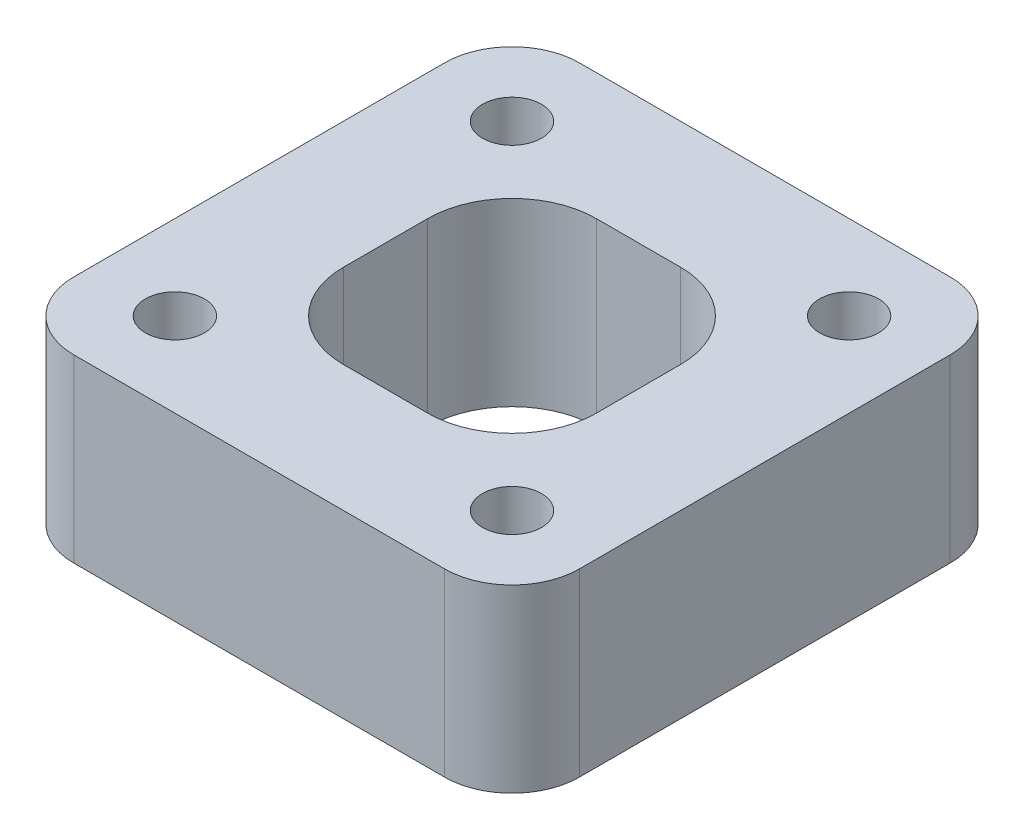
ISO-10303-21;
HEADER;
FILE_DESCRIPTION(('STEP AP214'),'2;1');
FILE_NAME('part.step','',(''),(''),'','','');
FILE_SCHEMA(('AUTOMOTIVE_DESIGN { 1 0 10303 214 1 1 1 1 }'));
ENDSEC;
DATA;
#1=APPLICATION_CONTEXT('core data for automotive mechanical design processes');
#2=APPLICATION_PROTOCOL_DEFINITION('international standard','automotive_design',2000,#1);
#3=PRODUCT_CONTEXT('',#1,'mechanical');
#4=PRODUCT('Part','Part','',(#3));
#5=PRODUCT_RELATED_PRODUCT_CATEGORY('part','',(#4));
#6=PRODUCT_DEFINITION_FORMATION('','',#4);
#7=PRODUCT_DEFINITION_CONTEXT('part definition',#1,'design');
#8=PRODUCT_DEFINITION('design','',#6,#7);
#9=PRODUCT_DEFINITION_SHAPE('','',#8);
#10=(LENGTH_UNIT() NAMED_UNIT(*) SI_UNIT(.MILLI.,.METRE.));
#11=(NAMED_UNIT(*) PLANE_ANGLE_UNIT() SI_UNIT($,.RADIAN.));
#12=(NAMED_UNIT(*) SI_UNIT($,.STERADIAN.) SOLID_ANGLE_UNIT());
#13=UNCERTAINTY_MEASURE_WITH_UNIT(LENGTH_MEASURE(1.E-05),#10,'distance_accuracy_value','');
#14=(GEOMETRIC_REPRESENTATION_CONTEXT(3) GLOBAL_UNCERTAINTY_ASSIGNED_CONTEXT((#13)) GLOBAL_UNIT_ASSIGNED_CONTEXT((#10,
#11,#12)) REPRESENTATION_CONTEXT('',''));
#15=CARTESIAN_POINT('',(0.,0.,0.));
#16=DIRECTION('',(0.,0.,1.));
#17=DIRECTION('',(1.,0.,0.));
#18=AXIS2_PLACEMENT_3D('',#15,#16,#17);
#19=CARTESIAN_POINT('',(15.,5.35,15.));
#20=DIRECTION('',(-1.,0.,0.));
#21=DIRECTION('',(0.,0.,1.));
#22=AXIS2_PLACEMENT_3D('',#19,#20,#21);
#23=PLANE('',#22);
#24=DIRECTION('',(0.,0.,-1.));
#25=VECTOR('',#24,1.);
#26=CARTESIAN_POINT('',(15.,-5.35,15.));
#27=LINE('',#26,#25);
#28=CARTESIAN_POINT('',(15.,-5.35,11.));
#29=VERTEX_POINT('',#28);
#30=CARTESIAN_POINT('',(15.,-5.35,-11.));
#31=VERTEX_POINT('',#30);
#32=EDGE_CURVE('E212',#29,#31,#27,.T.);
#33=ORIENTED_EDGE('',*,*,#32,.T.);
#34=DIRECTION('',(0.,-1.,0.));
#35=VECTOR('',#34,1.);
#36=CARTESIAN_POINT('',(15.,5.35,-11.));
#37=LINE('',#36,#35);
#38=CARTESIAN_POINT('',(15.,5.35,-11.));
#39=VERTEX_POINT('',#38);
#40=EDGE_CURVE('E11',#31,#39,#37,.F.);
#41=ORIENTED_EDGE('',*,*,#40,.T.);
#42=DIRECTION('',(0.,0.,-1.));
#43=VECTOR('',#42,1.);
#44=CARTESIAN_POINT('',(15.,5.35,15.));
#45=LINE('',#44,#43);
#46=CARTESIAN_POINT('',(15.,5.35,11.));
#47=VERTEX_POINT('',#46);
#48=EDGE_CURVE('E215',#47,#39,#45,.T.);
#49=ORIENTED_EDGE('',*,*,#48,.F.);
#50=DIRECTION('',(0.,-1.,0.));
#51=VECTOR('',#50,1.);
#52=CARTESIAN_POINT('',(15.,5.35,11.));
#53=LINE('',#52,#51);
#54=EDGE_CURVE('E43',#47,#29,#53,.T.);
#55=ORIENTED_EDGE('',*,*,#54,.T.);
#56=EDGE_LOOP('',(#33,#41,#49,#55));
#57=FACE_BOUND('',#56,.T.);
#58=ADVANCED_FACE('F35',(#57),#23,.F.);
#59=CARTESIAN_POINT('',(-15.,5.35,-15.));
#60=DIRECTION('',(0.,0.,1.));
#61=DIRECTION('',(1.,0.,0.));
#62=AXIS2_PLACEMENT_3D('',#59,#60,#61);
#63=PLANE('',#62);
#64=DIRECTION('',(-1.,0.,0.));
#65=VECTOR('',#64,1.);
#66=CARTESIAN_POINT('',(-15.,-5.35,-15.));
#67=LINE('',#66,#65);
#68=CARTESIAN_POINT('',(11.,-5.35,-15.));
#69=VERTEX_POINT('',#68);
#70=CARTESIAN_POINT('',(-11.,-5.35,-15.));
#71=VERTEX_POINT('',#70);
#72=EDGE_CURVE('E228',#69,#71,#67,.T.);
#73=ORIENTED_EDGE('',*,*,#72,.T.);
#74=DIRECTION('',(0.,-1.,0.));
#75=VECTOR('',#74,1.);
#76=CARTESIAN_POINT('',(-11.,5.35,-15.));
#77=LINE('',#76,#75);
#78=CARTESIAN_POINT('',(-11.,5.35,-15.));
#79=VERTEX_POINT('',#78);
#80=EDGE_CURVE('E50',#71,#79,#77,.F.);
#81=ORIENTED_EDGE('',*,*,#80,.T.);
#82=DIRECTION('',(-1.,0.,0.));
#83=VECTOR('',#82,1.);
#84=CARTESIAN_POINT('',(-15.,5.35,-15.));
#85=LINE('',#84,#83);
#86=CARTESIAN_POINT('',(11.,5.35,-15.));
#87=VERTEX_POINT('',#86);
#88=EDGE_CURVE('E217',#87,#79,#85,.T.);
#89=ORIENTED_EDGE('',*,*,#88,.F.);
#90=DIRECTION('',(0.,-1.,0.));
#91=VECTOR('',#90,1.);
#92=CARTESIAN_POINT('',(11.,5.35,-15.));
#93=LINE('',#92,#91);
#94=EDGE_CURVE('E285',#87,#69,#93,.T.);
#95=ORIENTED_EDGE('',*,*,#94,.T.);
#96=EDGE_LOOP('',(#73,#81,#89,#95));
#97=FACE_BOUND('',#96,.T.);
#98=ADVANCED_FACE('F303',(#97),#63,.F.);
#99=CARTESIAN_POINT('',(-15.,5.35,15.));
#100=DIRECTION('',(1.,0.,0.));
#101=DIRECTION('',(0.,0.,-1.));
#102=AXIS2_PLACEMENT_3D('',#99,#100,#101);
#103=PLANE('',#102);
#104=DIRECTION('',(0.,0.,1.));
#105=VECTOR('',#104,1.);
#106=CARTESIAN_POINT('',(-15.,-5.35,15.));
#107=LINE('',#106,#105);
#108=CARTESIAN_POINT('',(-15.,-5.35,-11.));
#109=VERTEX_POINT('',#108);
#110=CARTESIAN_POINT('',(-15.,-5.35,11.));
#111=VERTEX_POINT('',#110);
#112=EDGE_CURVE('E230',#109,#111,#107,.T.);
#113=ORIENTED_EDGE('',*,*,#112,.T.);
#114=DIRECTION('',(0.,-1.,0.));
#115=VECTOR('',#114,1.);
#116=CARTESIAN_POINT('',(-15.,5.35,11.));
#117=LINE('',#116,#115);
#118=CARTESIAN_POINT('',(-15.,5.35,11.));
#119=VERTEX_POINT('',#118);
#120=EDGE_CURVE('E276',#111,#119,#117,.F.);
#121=ORIENTED_EDGE('',*,*,#120,.T.);
#122=DIRECTION('',(0.,0.,1.));
#123=VECTOR('',#122,1.);
#124=CARTESIAN_POINT('',(-15.,5.35,15.));
#125=LINE('',#124,#123);
#126=CARTESIAN_POINT('',(-15.,5.35,-11.));
#127=VERTEX_POINT('',#126);
#128=EDGE_CURVE('E220',#127,#119,#125,.T.);
#129=ORIENTED_EDGE('',*,*,#128,.F.);
#130=DIRECTION('',(0.,-1.,0.));
#131=VECTOR('',#130,1.);
#132=CARTESIAN_POINT('',(-15.,5.35,-11.));
#133=LINE('',#132,#131);
#134=EDGE_CURVE('E273',#127,#109,#133,.T.);
#135=ORIENTED_EDGE('',*,*,#134,.T.);
#136=EDGE_LOOP('',(#113,#121,#129,#135));
#137=FACE_BOUND('',#136,.T.);
#138=ADVANCED_FACE('F311',(#137),#103,.F.);
#139=CARTESIAN_POINT('',(-15.,5.35,15.));
#140=DIRECTION('',(0.,0.,-1.));
#141=DIRECTION('',(-1.,0.,0.));
#142=AXIS2_PLACEMENT_3D('',#139,#140,#141);
#143=PLANE('',#142);
#144=DIRECTION('',(1.,0.,0.));
#145=VECTOR('',#144,1.);
#146=CARTESIAN_POINT('',(-15.,5.35,15.));
#147=LINE('',#146,#145);
#148=CARTESIAN_POINT('',(-11.,5.35,15.));
#149=VERTEX_POINT('',#148);
#150=CARTESIAN_POINT('',(11.,5.35,15.));
#151=VERTEX_POINT('',#150);
#152=EDGE_CURVE('E223',#149,#151,#147,.T.);
#153=ORIENTED_EDGE('',*,*,#152,.F.);
#154=DIRECTION('',(0.,-1.,0.));
#155=VECTOR('',#154,1.);
#156=CARTESIAN_POINT('',(-11.,5.35,15.));
#157=LINE('',#156,#155);
#158=CARTESIAN_POINT('',(-11.,-5.35,15.));
#159=VERTEX_POINT('',#158);
#160=EDGE_CURVE('E262',#149,#159,#157,.T.);
#161=ORIENTED_EDGE('',*,*,#160,.T.);
#162=DIRECTION('',(1.,0.,0.));
#163=VECTOR('',#162,1.);
#164=CARTESIAN_POINT('',(-15.,-5.35,15.));
#165=LINE('',#164,#163);
#166=CARTESIAN_POINT('',(11.,-5.35,15.));
#167=VERTEX_POINT('',#166);
#168=EDGE_CURVE('E218',#159,#167,#165,.T.);
#169=ORIENTED_EDGE('',*,*,#168,.T.);
#170=DIRECTION('',(0.,-1.,0.));
#171=VECTOR('',#170,1.);
#172=CARTESIAN_POINT('',(11.,5.35,15.));
#173=LINE('',#172,#171);
#174=EDGE_CURVE('E260',#167,#151,#173,.F.);
#175=ORIENTED_EDGE('',*,*,#174,.T.);
#176=EDGE_LOOP('',(#153,#161,#169,#175));
#177=FACE_BOUND('',#176,.T.);
#178=ADVANCED_FACE('F319',(#177),#143,.F.);
#179=CARTESIAN_POINT('',(0.,5.35,0.));
#180=DIRECTION('',(0.,-1.,0.));
#181=DIRECTION('',(0.,0.,-1.));
#182=AXIS2_PLACEMENT_3D('',#179,#180,#181);
#183=PLANE('',#182);
#184=DIRECTION('',(1.,0.,0.));
#185=VECTOR('',#184,1.);
#186=CARTESIAN_POINT('',(-7.5,5.35,7.5));
#187=LINE('',#186,#185);
#188=CARTESIAN_POINT('',(-2.5,5.35,7.5));
#189=VERTEX_POINT('',#188);
#190=CARTESIAN_POINT('',(2.5,5.35,7.5));
#191=VERTEX_POINT('',#190);
#192=EDGE_CURVE('E166',#189,#191,#187,.T.);
#193=ORIENTED_EDGE('',*,*,#192,.F.);
#194=CARTESIAN_POINT('',(-2.5,5.35,2.5));
#195=DIRECTION('',(0.,-1.,0.));
#196=DIRECTION('',(0.,0.,-1.));
#197=AXIS2_PLACEMENT_3D('',#194,#195,#196);
#198=CIRCLE('',#197,5.);
#199=CARTESIAN_POINT('',(-7.5,5.35,2.5));
#200=VERTEX_POINT('',#199);
#201=EDGE_CURVE('E149',#189,#200,#198,.T.);
#202=ORIENTED_EDGE('',*,*,#201,.T.);
#203=DIRECTION('',(0.,0.,1.));
#204=VECTOR('',#203,1.);
#205=CARTESIAN_POINT('',(-7.5,5.35,-7.5));
#206=LINE('',#205,#204);
#207=CARTESIAN_POINT('',(-7.5,5.35,-2.5));
#208=VERTEX_POINT('',#207);
#209=EDGE_CURVE('E178',#208,#200,#206,.T.);
#210=ORIENTED_EDGE('',*,*,#209,.F.);
#211=CARTESIAN_POINT('',(-2.5,5.35,-2.5));
#212=DIRECTION('',(0.,-1.,0.));
#213=DIRECTION('',(0.,0.,-1.));
#214=AXIS2_PLACEMENT_3D('',#211,#212,#213);
#215=CIRCLE('',#214,5.);
#216=CARTESIAN_POINT('',(-2.5,5.35,-7.5));
#217=VERTEX_POINT('',#216);
#218=EDGE_CURVE('E256',#208,#217,#215,.T.);
#219=ORIENTED_EDGE('',*,*,#218,.T.);
#220=DIRECTION('',(-1.,0.,0.));
#221=VECTOR('',#220,1.);
#222=CARTESIAN_POINT('',(-7.5,5.35,-7.5));
#223=LINE('',#222,#221);
#224=CARTESIAN_POINT('',(2.5,5.35,-7.5));
#225=VERTEX_POINT('',#224);
#226=EDGE_CURVE('E181',#225,#217,#223,.T.);
#227=ORIENTED_EDGE('',*,*,#226,.F.);
#228=CARTESIAN_POINT('',(2.5,5.35,-2.5));
#229=DIRECTION('',(0.,-1.,0.));
#230=DIRECTION('',(0.,0.,-1.));
#231=AXIS2_PLACEMENT_3D('',#228,#229,#230);
#232=CIRCLE('',#231,5.);
#233=CARTESIAN_POINT('',(7.5,5.35,-2.5));
#234=VERTEX_POINT('',#233);
#235=EDGE_CURVE('E252',#225,#234,#232,.T.);
#236=ORIENTED_EDGE('',*,*,#235,.T.);
#237=DIRECTION('',(0.,0.,-1.));
#238=VECTOR('',#237,1.);
#239=CARTESIAN_POINT('',(7.5,5.35,-7.5));
#240=LINE('',#239,#238);
#241=CARTESIAN_POINT('',(7.5,5.35,2.5));
#242=VERTEX_POINT('',#241);
#243=EDGE_CURVE('E177',#242,#234,#240,.T.);
#244=ORIENTED_EDGE('',*,*,#243,.F.);
#245=CARTESIAN_POINT('',(2.5,5.35,2.5));
#246=DIRECTION('',(0.,-1.,0.));
#247=DIRECTION('',(0.,0.,-1.));
#248=AXIS2_PLACEMENT_3D('',#245,#246,#247);
#249=CIRCLE('',#248,5.);
#250=EDGE_CURVE('E176',#242,#191,#249,.T.);
#251=ORIENTED_EDGE('',*,*,#250,.T.);
#252=EDGE_LOOP('',(#193,#202,#210,#219,#227,#236,#244,#251));
#253=FACE_BOUND('',#252,.T.);
#254=CARTESIAN_POINT('',(10.,5.35,-10.));
#255=DIRECTION('',(0.,1.,0.));
#256=DIRECTION('',(0.,0.,1.));
#257=AXIS2_PLACEMENT_3D('',#254,#255,#256);
#258=CIRCLE('',#257,1.75);
#259=CARTESIAN_POINT('',(10.,5.35,-8.25));
#260=VERTEX_POINT('',#259);
#261=EDGE_CURVE('E189',#260,#260,#258,.T.);
#262=ORIENTED_EDGE('',*,*,#261,.F.);
#263=EDGE_LOOP('',(#262));
#264=FACE_BOUND('',#263,.T.);
#265=CARTESIAN_POINT('',(10.,5.35,10.));
#266=DIRECTION('',(0.,1.,0.));
#267=DIRECTION('',(0.,0.,1.));
#268=AXIS2_PLACEMENT_3D('',#265,#266,#267);
#269=CIRCLE('',#268,1.75);
#270=CARTESIAN_POINT('',(10.,5.35,11.75));
#271=VERTEX_POINT('',#270);
#272=EDGE_CURVE('E196',#271,#271,#269,.T.);
#273=ORIENTED_EDGE('',*,*,#272,.F.);
#274=EDGE_LOOP('',(#273));
#275=FACE_BOUND('',#274,.T.);
#276=CARTESIAN_POINT('',(-10.,5.35,10.));
#277=DIRECTION('',(0.,1.,0.));
#278=DIRECTION('',(0.,0.,1.));
#279=AXIS2_PLACEMENT_3D('',#276,#277,#278);
#280=CIRCLE('',#279,1.75);
#281=CARTESIAN_POINT('',(-10.,5.35,11.75));
#282=VERTEX_POINT('',#281);
#283=EDGE_CURVE('E202',#282,#282,#280,.T.);
#284=ORIENTED_EDGE('',*,*,#283,.F.);
#285=EDGE_LOOP('',(#284));
#286=FACE_BOUND('',#285,.T.);
#287=CARTESIAN_POINT('',(-10.,5.35,-10.));
#288=DIRECTION('',(0.,1.,0.));
#289=DIRECTION('',(0.,0.,1.));
#290=AXIS2_PLACEMENT_3D('',#287,#288,#289);
#291=CIRCLE('',#290,1.75);
#292=CARTESIAN_POINT('',(-10.,5.35,-8.25));
#293=VERTEX_POINT('',#292);
#294=EDGE_CURVE('E209',#293,#293,#291,.T.);
#295=ORIENTED_EDGE('',*,*,#294,.F.);
#296=EDGE_LOOP('',(#295));
#297=FACE_BOUND('',#296,.T.);
#298=ORIENTED_EDGE('',*,*,#128,.T.);
#299=CARTESIAN_POINT('',(-11.,5.35,11.));
#300=DIRECTION('',(0.,-1.,0.));
#301=DIRECTION('',(0.,0.,-1.));
#302=AXIS2_PLACEMENT_3D('',#299,#300,#301);
#303=CIRCLE('',#302,4.);
#304=EDGE_CURVE('E283',#119,#149,#303,.F.);
#305=ORIENTED_EDGE('',*,*,#304,.T.);
#306=ORIENTED_EDGE('',*,*,#152,.T.);
#307=CARTESIAN_POINT('',(11.,5.35,11.));
#308=DIRECTION('',(0.,-1.,0.));
#309=DIRECTION('',(0.,0.,-1.));
#310=AXIS2_PLACEMENT_3D('',#307,#308,#309);
#311=CIRCLE('',#310,4.);
#312=EDGE_CURVE('E278',#151,#47,#311,.F.);
#313=ORIENTED_EDGE('',*,*,#312,.T.);
#314=ORIENTED_EDGE('',*,*,#48,.T.);
#315=CARTESIAN_POINT('',(11.,5.35,-11.));
#316=DIRECTION('',(0.,-1.,0.));
#317=DIRECTION('',(0.,0.,-1.));
#318=AXIS2_PLACEMENT_3D('',#315,#316,#317);
#319=CIRCLE('',#318,4.);
#320=EDGE_CURVE('E57',#39,#87,#319,.F.);
#321=ORIENTED_EDGE('',*,*,#320,.T.);
#322=ORIENTED_EDGE('',*,*,#88,.T.);
#323=CARTESIAN_POINT('',(-11.,5.35,-11.));
#324=DIRECTION('',(0.,-1.,0.));
#325=DIRECTION('',(0.,0.,-1.));
#326=AXIS2_PLACEMENT_3D('',#323,#324,#325);
#327=CIRCLE('',#326,4.);
#328=EDGE_CURVE('E281',#79,#127,#327,.F.);
#329=ORIENTED_EDGE('',*,*,#328,.T.);
#330=EDGE_LOOP('',(#298,#305,#306,#313,#314,#321,#322,#329));
#331=FACE_BOUND('',#330,.T.);
#332=ADVANCED_FACE('F173',(#253,#264,#275,#286,#297,#331),#183,.F.);
#333=CARTESIAN_POINT('',(0.,-5.35,0.));
#334=DIRECTION('',(0.,-1.,0.));
#335=DIRECTION('',(0.,0.,-1.));
#336=AXIS2_PLACEMENT_3D('',#333,#334,#335);
#337=PLANE('',#336);
#338=DIRECTION('',(-1.,0.,0.));
#339=VECTOR('',#338,1.);
#340=CARTESIAN_POINT('',(-7.5,-5.35,-7.5));
#341=LINE('',#340,#339);
#342=CARTESIAN_POINT('',(2.5,-5.35,-7.5));
#343=VERTEX_POINT('',#342);
#344=CARTESIAN_POINT('',(-2.5,-5.35,-7.5));
#345=VERTEX_POINT('',#344);
#346=EDGE_CURVE('E208',#343,#345,#341,.T.);
#347=ORIENTED_EDGE('',*,*,#346,.T.);
#348=CARTESIAN_POINT('',(-2.5,-5.35,-2.5));
#349=DIRECTION('',(0.,-1.,0.));
#350=DIRECTION('',(0.,0.,-1.));
#351=AXIS2_PLACEMENT_3D('',#348,#349,#350);
#352=CIRCLE('',#351,5.);
#353=CARTESIAN_POINT('',(-7.5,-5.35,-2.5));
#354=VERTEX_POINT('',#353);
#355=EDGE_CURVE('E258',#345,#354,#352,.F.);
#356=ORIENTED_EDGE('',*,*,#355,.T.);
#357=DIRECTION('',(0.,0.,1.));
#358=VECTOR('',#357,1.);
#359=CARTESIAN_POINT('',(-7.5,-5.35,-7.5));
#360=LINE('',#359,#358);
#361=CARTESIAN_POINT('',(-7.5,-5.35,2.5));
#362=VERTEX_POINT('',#361);
#363=EDGE_CURVE('E188',#354,#362,#360,.T.);
#364=ORIENTED_EDGE('',*,*,#363,.T.);
#365=CARTESIAN_POINT('',(-2.5,-5.35,2.5));
#366=DIRECTION('',(0.,-1.,0.));
#367=DIRECTION('',(0.,0.,-1.));
#368=AXIS2_PLACEMENT_3D('',#365,#366,#367);
#369=CIRCLE('',#368,5.);
#370=CARTESIAN_POINT('',(-2.5,-5.35,7.5));
#371=VERTEX_POINT('',#370);
#372=EDGE_CURVE('E159',#362,#371,#369,.F.);
#373=ORIENTED_EDGE('',*,*,#372,.T.);
#374=DIRECTION('',(1.,0.,0.));
#375=VECTOR('',#374,1.);
#376=CARTESIAN_POINT('',(-7.5,-5.35,7.5));
#377=LINE('',#376,#375);
#378=CARTESIAN_POINT('',(2.5,-5.35,7.5));
#379=VERTEX_POINT('',#378);
#380=EDGE_CURVE('E169',#371,#379,#377,.T.);
#381=ORIENTED_EDGE('',*,*,#380,.T.);
#382=CARTESIAN_POINT('',(2.5,-5.35,2.5));
#383=DIRECTION('',(0.,-1.,0.));
#384=DIRECTION('',(0.,0.,-1.));
#385=AXIS2_PLACEMENT_3D('',#382,#383,#384);
#386=CIRCLE('',#385,5.);
#387=CARTESIAN_POINT('',(7.5,-5.35,2.5));
#388=VERTEX_POINT('',#387);
#389=EDGE_CURVE('E250',#379,#388,#386,.F.);
#390=ORIENTED_EDGE('',*,*,#389,.T.);
#391=DIRECTION('',(0.,0.,-1.));
#392=VECTOR('',#391,1.);
#393=CARTESIAN_POINT('',(7.5,-5.35,-7.5));
#394=LINE('',#393,#392);
#395=CARTESIAN_POINT('',(7.5,-5.35,-2.5));
#396=VERTEX_POINT('',#395);
#397=EDGE_CURVE('E536',#388,#396,#394,.T.);
#398=ORIENTED_EDGE('',*,*,#397,.T.);
#399=CARTESIAN_POINT('',(2.5,-5.35,-2.5));
#400=DIRECTION('',(0.,-1.,0.));
#401=DIRECTION('',(0.,0.,-1.));
#402=AXIS2_PLACEMENT_3D('',#399,#400,#401);
#403=CIRCLE('',#402,5.);
#404=EDGE_CURVE('E254',#396,#343,#403,.F.);
#405=ORIENTED_EDGE('',*,*,#404,.T.);
#406=EDGE_LOOP('',(#347,#356,#364,#373,#381,#390,#398,#405));
#407=FACE_BOUND('',#406,.T.);
#408=CARTESIAN_POINT('',(10.,-5.35,-10.));
#409=DIRECTION('',(0.,1.,0.));
#410=DIRECTION('',(0.,0.,1.));
#411=AXIS2_PLACEMENT_3D('',#408,#409,#410);
#412=CIRCLE('',#411,1.75);
#413=CARTESIAN_POINT('',(10.,-5.35,-8.25));
#414=VERTEX_POINT('',#413);
#415=EDGE_CURVE('E193',#414,#414,#412,.T.);
#416=ORIENTED_EDGE('',*,*,#415,.T.);
#417=EDGE_LOOP('',(#416));
#418=FACE_BOUND('',#417,.T.);
#419=CARTESIAN_POINT('',(10.,-5.35,10.));
#420=DIRECTION('',(0.,1.,0.));
#421=DIRECTION('',(0.,0.,1.));
#422=AXIS2_PLACEMENT_3D('',#419,#420,#421);
#423=CIRCLE('',#422,1.75);
#424=CARTESIAN_POINT('',(10.,-5.35,11.75));
#425=VERTEX_POINT('',#424);
#426=EDGE_CURVE('E199',#425,#425,#423,.T.);
#427=ORIENTED_EDGE('',*,*,#426,.T.);
#428=EDGE_LOOP('',(#427));
#429=FACE_BOUND('',#428,.T.);
#430=CARTESIAN_POINT('',(-10.,-5.35,10.));
#431=DIRECTION('',(0.,1.,0.));
#432=DIRECTION('',(0.,0.,1.));
#433=AXIS2_PLACEMENT_3D('',#430,#431,#432);
#434=CIRCLE('',#433,1.75);
#435=CARTESIAN_POINT('',(-10.,-5.35,11.75));
#436=VERTEX_POINT('',#435);
#437=EDGE_CURVE('E205',#436,#436,#434,.T.);
#438=ORIENTED_EDGE('',*,*,#437,.T.);
#439=EDGE_LOOP('',(#438));
#440=FACE_BOUND('',#439,.T.);
#441=CARTESIAN_POINT('',(-10.,-5.35,-10.));
#442=DIRECTION('',(0.,1.,0.));
#443=DIRECTION('',(0.,0.,1.));
#444=AXIS2_PLACEMENT_3D('',#441,#442,#443);
#445=CIRCLE('',#444,1.75);
#446=CARTESIAN_POINT('',(-10.,-5.35,-8.25));
#447=VERTEX_POINT('',#446);
#448=EDGE_CURVE('E192',#447,#447,#445,.T.);
#449=ORIENTED_EDGE('',*,*,#448,.T.);
#450=EDGE_LOOP('',(#449));
#451=FACE_BOUND('',#450,.T.);
#452=ORIENTED_EDGE('',*,*,#168,.F.);
#453=CARTESIAN_POINT('',(-11.,-5.35,11.));
#454=DIRECTION('',(0.,-1.,0.));
#455=DIRECTION('',(0.,0.,-1.));
#456=AXIS2_PLACEMENT_3D('',#453,#454,#455);
#457=CIRCLE('',#456,4.);
#458=EDGE_CURVE('E271',#159,#111,#457,.T.);
#459=ORIENTED_EDGE('',*,*,#458,.T.);
#460=ORIENTED_EDGE('',*,*,#112,.F.);
#461=CARTESIAN_POINT('',(-11.,-5.35,-11.));
#462=DIRECTION('',(0.,-1.,0.));
#463=DIRECTION('',(0.,0.,-1.));
#464=AXIS2_PLACEMENT_3D('',#461,#462,#463);
#465=CIRCLE('',#464,4.);
#466=EDGE_CURVE('E269',#109,#71,#465,.T.);
#467=ORIENTED_EDGE('',*,*,#466,.T.);
#468=ORIENTED_EDGE('',*,*,#72,.F.);
#469=CARTESIAN_POINT('',(11.,-5.35,-11.));
#470=DIRECTION('',(0.,-1.,0.));
#471=DIRECTION('',(0.,0.,-1.));
#472=AXIS2_PLACEMENT_3D('',#469,#470,#471);
#473=CIRCLE('',#472,4.);
#474=EDGE_CURVE('E267',#69,#31,#473,.T.);
#475=ORIENTED_EDGE('',*,*,#474,.T.);
#476=ORIENTED_EDGE('',*,*,#32,.F.);
#477=CARTESIAN_POINT('',(11.,-5.35,11.));
#478=DIRECTION('',(0.,-1.,0.));
#479=DIRECTION('',(0.,0.,-1.));
#480=AXIS2_PLACEMENT_3D('',#477,#478,#479);
#481=CIRCLE('',#480,4.);
#482=EDGE_CURVE('E265',#29,#167,#481,.T.);
#483=ORIENTED_EDGE('',*,*,#482,.T.);
#484=EDGE_LOOP('',(#452,#459,#460,#467,#468,#475,#476,#483));
#485=FACE_BOUND('',#484,.T.);
#486=ADVANCED_FACE('F298',(#407,#418,#429,#440,#451,#485),#337,.T.);
#487=CARTESIAN_POINT('',(-10.,5.35,-10.));
#488=DIRECTION('',(0.,-1.,0.));
#489=DIRECTION('',(0.,0.,-1.));
#490=AXIS2_PLACEMENT_3D('',#487,#488,#489);
#491=CYLINDRICAL_SURFACE('',#490,1.75);
#492=ORIENTED_EDGE('',*,*,#294,.T.);
#493=EDGE_LOOP('',(#492));
#494=FACE_BOUND('',#493,.T.);
#495=ORIENTED_EDGE('',*,*,#448,.F.);
#496=EDGE_LOOP('',(#495));
#497=FACE_BOUND('',#496,.T.);
#498=ADVANCED_FACE('F452',(#494,#497),#491,.F.);
#499=CARTESIAN_POINT('',(-10.,5.35,10.));
#500=DIRECTION('',(0.,-1.,0.));
#501=DIRECTION('',(0.,0.,-1.));
#502=AXIS2_PLACEMENT_3D('',#499,#500,#501);
#503=CYLINDRICAL_SURFACE('',#502,1.75);
#504=ORIENTED_EDGE('',*,*,#283,.T.);
#505=EDGE_LOOP('',(#504));
#506=FACE_BOUND('',#505,.T.);
#507=ORIENTED_EDGE('',*,*,#437,.F.);
#508=EDGE_LOOP('',(#507));
#509=FACE_BOUND('',#508,.T.);
#510=ADVANCED_FACE('F443',(#506,#509),#503,.F.);
#511=CARTESIAN_POINT('',(10.,5.35,10.));
#512=DIRECTION('',(0.,-1.,0.));
#513=DIRECTION('',(0.,0.,-1.));
#514=AXIS2_PLACEMENT_3D('',#511,#512,#513);
#515=CYLINDRICAL_SURFACE('',#514,1.75);
#516=ORIENTED_EDGE('',*,*,#272,.T.);
#517=EDGE_LOOP('',(#516));
#518=FACE_BOUND('',#517,.T.);
#519=ORIENTED_EDGE('',*,*,#426,.F.);
#520=EDGE_LOOP('',(#519));
#521=FACE_BOUND('',#520,.T.);
#522=ADVANCED_FACE('F434',(#518,#521),#515,.F.);
#523=CARTESIAN_POINT('',(10.,5.35,-10.));
#524=DIRECTION('',(0.,-1.,0.));
#525=DIRECTION('',(0.,0.,-1.));
#526=AXIS2_PLACEMENT_3D('',#523,#524,#525);
#527=CYLINDRICAL_SURFACE('',#526,1.75);
#528=ORIENTED_EDGE('',*,*,#261,.T.);
#529=EDGE_LOOP('',(#528));
#530=FACE_BOUND('',#529,.T.);
#531=ORIENTED_EDGE('',*,*,#415,.F.);
#532=EDGE_LOOP('',(#531));
#533=FACE_BOUND('',#532,.T.);
#534=ADVANCED_FACE('F425',(#530,#533),#527,.F.);
#535=CARTESIAN_POINT('',(-7.5,-5.35,-7.5));
#536=DIRECTION('',(-1.,0.,0.));
#537=DIRECTION('',(0.,0.,1.));
#538=AXIS2_PLACEMENT_3D('',#535,#536,#537);
#539=PLANE('',#538);
#540=ORIENTED_EDGE('',*,*,#209,.T.);
#541=DIRECTION('',(0.,1.,0.));
#542=VECTOR('',#541,1.);
#543=CARTESIAN_POINT('',(-7.5,-5.35,2.5));
#544=LINE('',#543,#542);
#545=EDGE_CURVE('E154',#200,#362,#544,.F.);
#546=ORIENTED_EDGE('',*,*,#545,.T.);
#547=ORIENTED_EDGE('',*,*,#363,.F.);
#548=DIRECTION('',(0.,1.,0.));
#549=VECTOR('',#548,1.);
#550=CARTESIAN_POINT('',(-7.5,5.35,-2.5));
#551=LINE('',#550,#549);
#552=EDGE_CURVE('E170',#354,#208,#551,.T.);
#553=ORIENTED_EDGE('',*,*,#552,.T.);
#554=EDGE_LOOP('',(#540,#546,#547,#553));
#555=FACE_BOUND('',#554,.T.);
#556=ADVANCED_FACE('F416',(#555),#539,.F.);
#557=CARTESIAN_POINT('',(-7.5,-5.35,-7.5));
#558=DIRECTION('',(0.,0.,-1.));
#559=DIRECTION('',(-1.,0.,0.));
#560=AXIS2_PLACEMENT_3D('',#557,#558,#559);
#561=PLANE('',#560);
#562=ORIENTED_EDGE('',*,*,#346,.F.);
#563=DIRECTION('',(0.,1.,0.));
#564=VECTOR('',#563,1.);
#565=CARTESIAN_POINT('',(2.5,5.35,-7.5));
#566=LINE('',#565,#564);
#567=EDGE_CURVE('E160',#343,#225,#566,.T.);
#568=ORIENTED_EDGE('',*,*,#567,.T.);
#569=ORIENTED_EDGE('',*,*,#226,.T.);
#570=DIRECTION('',(0.,1.,0.));
#571=VECTOR('',#570,1.);
#572=CARTESIAN_POINT('',(-2.5,-5.35,-7.5));
#573=LINE('',#572,#571);
#574=EDGE_CURVE('E244',#217,#345,#573,.F.);
#575=ORIENTED_EDGE('',*,*,#574,.T.);
#576=EDGE_LOOP('',(#562,#568,#569,#575));
#577=FACE_BOUND('',#576,.T.);
#578=ADVANCED_FACE('F407',(#577),#561,.F.);
#579=CARTESIAN_POINT('',(7.5,-5.35,-7.5));
#580=DIRECTION('',(1.,0.,0.));
#581=DIRECTION('',(0.,0.,-1.));
#582=AXIS2_PLACEMENT_3D('',#579,#580,#581);
#583=PLANE('',#582);
#584=ORIENTED_EDGE('',*,*,#397,.F.);
#585=DIRECTION('',(0.,1.,0.));
#586=VECTOR('',#585,1.);
#587=CARTESIAN_POINT('',(7.5,5.35,2.5));
#588=LINE('',#587,#586);
#589=EDGE_CURVE('E241',#388,#242,#588,.T.);
#590=ORIENTED_EDGE('',*,*,#589,.T.);
#591=ORIENTED_EDGE('',*,*,#243,.T.);
#592=DIRECTION('',(0.,1.,0.));
#593=VECTOR('',#592,1.);
#594=CARTESIAN_POINT('',(7.5,-5.35,-2.5));
#595=LINE('',#594,#593);
#596=EDGE_CURVE('E239',#234,#396,#595,.F.);
#597=ORIENTED_EDGE('',*,*,#596,.T.);
#598=EDGE_LOOP('',(#584,#590,#591,#597));
#599=FACE_BOUND('',#598,.T.);
#600=ADVANCED_FACE('F399',(#599),#583,.F.);
#601=CARTESIAN_POINT('',(-7.5,-5.35,7.5));
#602=DIRECTION('',(0.,0.,1.));
#603=DIRECTION('',(1.,0.,0.));
#604=AXIS2_PLACEMENT_3D('',#601,#602,#603);
#605=PLANE('',#604);
#606=ORIENTED_EDGE('',*,*,#380,.F.);
#607=DIRECTION('',(0.,1.,0.));
#608=VECTOR('',#607,1.);
#609=CARTESIAN_POINT('',(-2.5,5.35,7.5));
#610=LINE('',#609,#608);
#611=EDGE_CURVE('E153',#371,#189,#610,.T.);
#612=ORIENTED_EDGE('',*,*,#611,.T.);
#613=ORIENTED_EDGE('',*,*,#192,.T.);
#614=DIRECTION('',(0.,1.,0.));
#615=VECTOR('',#614,1.);
#616=CARTESIAN_POINT('',(2.5,-5.35,7.5));
#617=LINE('',#616,#615);
#618=EDGE_CURVE('E171',#191,#379,#617,.F.);
#619=ORIENTED_EDGE('',*,*,#618,.T.);
#620=EDGE_LOOP('',(#606,#612,#613,#619));
#621=FACE_BOUND('',#620,.T.);
#622=ADVANCED_FACE('F165',(#621),#605,.F.);
#623=CARTESIAN_POINT('',(-2.5,-5.35,2.5));
#624=DIRECTION('',(0.,-1.,0.));
#625=DIRECTION('',(0.,0.,-1.));
#626=AXIS2_PLACEMENT_3D('',#623,#624,#625);
#627=CYLINDRICAL_SURFACE('',#626,5.);
#628=ORIENTED_EDGE('',*,*,#372,.F.);
#629=ORIENTED_EDGE('',*,*,#545,.F.);
#630=ORIENTED_EDGE('',*,*,#201,.F.);
#631=ORIENTED_EDGE('',*,*,#611,.F.);
#632=EDGE_LOOP('',(#628,#629,#630,#631));
#633=FACE_BOUND('',#632,.T.);
#634=ADVANCED_FACE('F152',(#633),#627,.F.);
#635=CARTESIAN_POINT('',(2.5,-5.35,2.5));
#636=DIRECTION('',(0.,-1.,0.));
#637=DIRECTION('',(0.,0.,-1.));
#638=AXIS2_PLACEMENT_3D('',#635,#636,#637);
#639=CYLINDRICAL_SURFACE('',#638,5.);
#640=ORIENTED_EDGE('',*,*,#389,.F.);
#641=ORIENTED_EDGE('',*,*,#618,.F.);
#642=ORIENTED_EDGE('',*,*,#250,.F.);
#643=ORIENTED_EDGE('',*,*,#589,.F.);
#644=EDGE_LOOP('',(#640,#641,#642,#643));
#645=FACE_BOUND('',#644,.T.);
#646=ADVANCED_FACE('F335',(#645),#639,.F.);
#647=CARTESIAN_POINT('',(2.5,-5.35,-2.5));
#648=DIRECTION('',(0.,-1.,0.));
#649=DIRECTION('',(0.,0.,-1.));
#650=AXIS2_PLACEMENT_3D('',#647,#648,#649);
#651=CYLINDRICAL_SURFACE('',#650,5.);
#652=ORIENTED_EDGE('',*,*,#404,.F.);
#653=ORIENTED_EDGE('',*,*,#596,.F.);
#654=ORIENTED_EDGE('',*,*,#235,.F.);
#655=ORIENTED_EDGE('',*,*,#567,.F.);
#656=EDGE_LOOP('',(#652,#653,#654,#655));
#657=FACE_BOUND('',#656,.T.);
#658=ADVANCED_FACE('F338',(#657),#651,.F.);
#659=CARTESIAN_POINT('',(-2.5,-5.35,-2.5));
#660=DIRECTION('',(0.,-1.,0.));
#661=DIRECTION('',(0.,0.,-1.));
#662=AXIS2_PLACEMENT_3D('',#659,#660,#661);
#663=CYLINDRICAL_SURFACE('',#662,5.);
#664=ORIENTED_EDGE('',*,*,#355,.F.);
#665=ORIENTED_EDGE('',*,*,#574,.F.);
#666=ORIENTED_EDGE('',*,*,#218,.F.);
#667=ORIENTED_EDGE('',*,*,#552,.F.);
#668=EDGE_LOOP('',(#664,#665,#666,#667));
#669=FACE_BOUND('',#668,.T.);
#670=ADVANCED_FACE('F342',(#669),#663,.F.);
#671=CARTESIAN_POINT('',(-11.,5.35,11.));
#672=DIRECTION('',(0.,-1.,0.));
#673=DIRECTION('',(0.,0.,-1.));
#674=AXIS2_PLACEMENT_3D('',#671,#672,#673);
#675=CYLINDRICAL_SURFACE('',#674,4.);
#676=ORIENTED_EDGE('',*,*,#304,.F.);
#677=ORIENTED_EDGE('',*,*,#120,.F.);
#678=ORIENTED_EDGE('',*,*,#458,.F.);
#679=ORIENTED_EDGE('',*,*,#160,.F.);
#680=EDGE_LOOP('',(#676,#677,#678,#679));
#681=FACE_BOUND('',#680,.T.);
#682=ADVANCED_FACE('F316',(#681),#675,.T.);
#683=CARTESIAN_POINT('',(-11.,5.35,-11.));
#684=DIRECTION('',(0.,-1.,0.));
#685=DIRECTION('',(0.,0.,-1.));
#686=AXIS2_PLACEMENT_3D('',#683,#684,#685);
#687=CYLINDRICAL_SURFACE('',#686,4.);
#688=ORIENTED_EDGE('',*,*,#328,.F.);
#689=ORIENTED_EDGE('',*,*,#80,.F.);
#690=ORIENTED_EDGE('',*,*,#466,.F.);
#691=ORIENTED_EDGE('',*,*,#134,.F.);
#692=EDGE_LOOP('',(#688,#689,#690,#691));
#693=FACE_BOUND('',#692,.T.);
#694=ADVANCED_FACE('F308',(#693),#687,.T.);
#695=CARTESIAN_POINT('',(11.,5.35,-11.));
#696=DIRECTION('',(0.,-1.,0.));
#697=DIRECTION('',(0.,0.,-1.));
#698=AXIS2_PLACEMENT_3D('',#695,#696,#697);
#699=CYLINDRICAL_SURFACE('',#698,4.);
#700=ORIENTED_EDGE('',*,*,#320,.F.);
#701=ORIENTED_EDGE('',*,*,#40,.F.);
#702=ORIENTED_EDGE('',*,*,#474,.F.);
#703=ORIENTED_EDGE('',*,*,#94,.F.);
#704=EDGE_LOOP('',(#700,#701,#702,#703));
#705=FACE_BOUND('',#704,.T.);
#706=ADVANCED_FACE('F302',(#705),#699,.T.);
#707=CARTESIAN_POINT('',(11.,5.35,11.));
#708=DIRECTION('',(0.,-1.,0.));
#709=DIRECTION('',(0.,0.,-1.));
#710=AXIS2_PLACEMENT_3D('',#707,#708,#709);
#711=CYLINDRICAL_SURFACE('',#710,4.);
#712=ORIENTED_EDGE('',*,*,#312,.F.);
#713=ORIENTED_EDGE('',*,*,#174,.F.);
#714=ORIENTED_EDGE('',*,*,#482,.F.);
#715=ORIENTED_EDGE('',*,*,#54,.F.);
#716=EDGE_LOOP('',(#712,#713,#714,#715));
#717=FACE_BOUND('',#716,.T.);
#718=ADVANCED_FACE('F37',(#717),#711,.T.);
#719=CLOSED_SHELL('',(#58,#98,#138,#178,#332,#486,#498,#510,#522,#534,#556,#578,#600,#622,#634,
#646,#658,#670,#682,#694,#706,#718));
#720=MANIFOLD_SOLID_BREP('B2',#719);
#721=ADVANCED_BREP_SHAPE_REPRESENTATION('',(#18,#720),#14);
#722=SHAPE_DEFINITION_REPRESENTATION(#9,#721);
ENDSEC;
END-ISO-10303-21;
